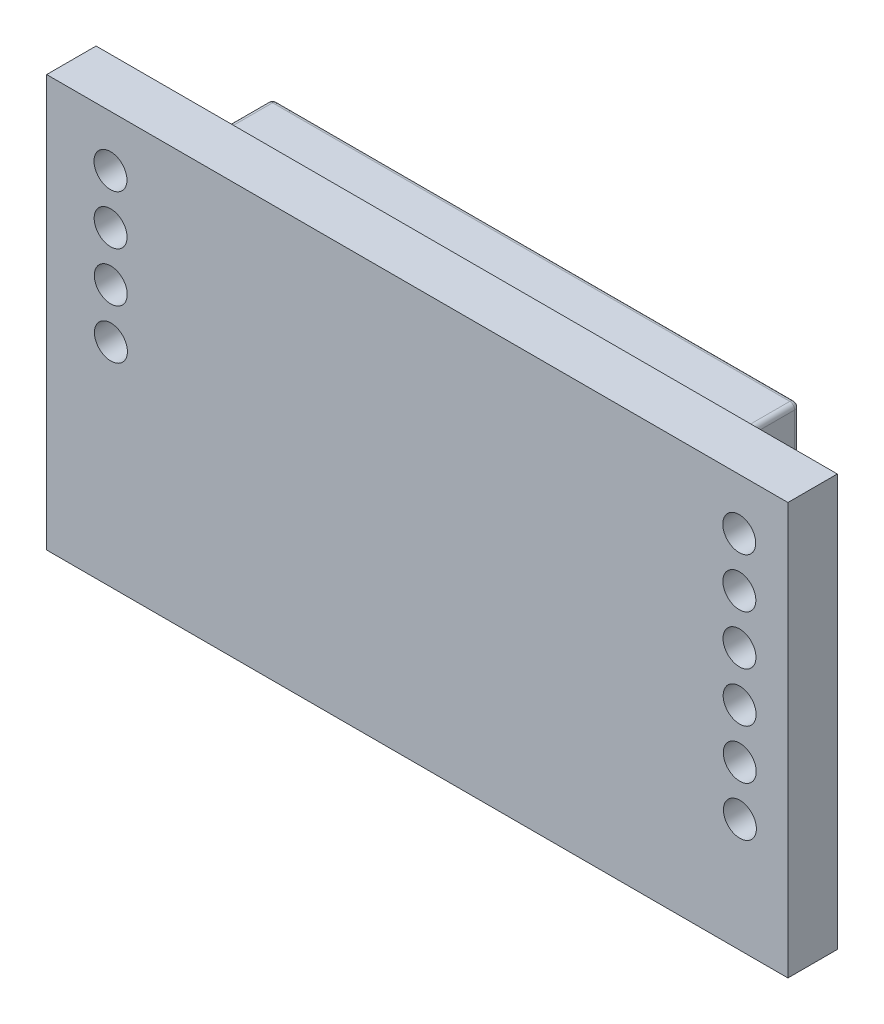
ISO-10303-21;
HEADER;
FILE_DESCRIPTION(('STEP AP214'),'2;1');
FILE_NAME('part.step','',(''),(''),'','','');
FILE_SCHEMA(('AUTOMOTIVE_DESIGN { 1 0 10303 214 1 1 1 1 }'));
ENDSEC;
DATA;
#1=APPLICATION_CONTEXT('core data for automotive mechanical design processes');
#2=APPLICATION_PROTOCOL_DEFINITION('international standard','automotive_design',2000,#1);
#3=PRODUCT_CONTEXT('',#1,'mechanical');
#4=PRODUCT('Part','Part','',(#3));
#5=PRODUCT_RELATED_PRODUCT_CATEGORY('part','',(#4));
#6=PRODUCT_DEFINITION_FORMATION('','',#4);
#7=PRODUCT_DEFINITION_CONTEXT('part definition',#1,'design');
#8=PRODUCT_DEFINITION('design','',#6,#7);
#9=PRODUCT_DEFINITION_SHAPE('','',#8);
#10=(LENGTH_UNIT() NAMED_UNIT(*) SI_UNIT(.MILLI.,.METRE.));
#11=(NAMED_UNIT(*) PLANE_ANGLE_UNIT() SI_UNIT($,.RADIAN.));
#12=(NAMED_UNIT(*) SI_UNIT($,.STERADIAN.) SOLID_ANGLE_UNIT());
#13=UNCERTAINTY_MEASURE_WITH_UNIT(LENGTH_MEASURE(1.E-05),#10,'distance_accuracy_value','');
#14=(GEOMETRIC_REPRESENTATION_CONTEXT(3) GLOBAL_UNCERTAINTY_ASSIGNED_CONTEXT((#13)) GLOBAL_UNIT_ASSIGNED_CONTEXT((#10,
#11,#12)) REPRESENTATION_CONTEXT('',''));
#15=CARTESIAN_POINT('',(0.,0.,0.));
#16=DIRECTION('',(0.,0.,1.));
#17=DIRECTION('',(1.,0.,0.));
#18=AXIS2_PLACEMENT_3D('',#15,#16,#17);
#19=CARTESIAN_POINT('',(0.,0.,0.));
#20=DIRECTION('',(0.,0.,1.));
#21=DIRECTION('',(1.,0.,0.));
#22=AXIS2_PLACEMENT_3D('',#19,#20,#21);
#23=PLANE('',#22);
#24=CARTESIAN_POINT('',(-41.1176214928793,18.8864329072938,0.));
#25=DIRECTION('',(0.,0.,1.));
#26=DIRECTION('',(1.,0.,0.));
#27=AXIS2_PLACEMENT_3D('',#24,#25,#26);
#28=CIRCLE('',#27,0.999999999999998);
#29=CARTESIAN_POINT('',(-40.1176214928793,18.8864329072938,0.));
#30=VERTEX_POINT('',#29);
#31=EDGE_CURVE('E243',#30,#30,#28,.F.);
#32=ORIENTED_EDGE('',*,*,#31,.F.);
#33=EDGE_LOOP('',(#32));
#34=FACE_BOUND('',#33,.T.);
#35=CARTESIAN_POINT('',(-41.1089333233604,15.8864454880352,0.));
#36=DIRECTION('',(0.,0.,1.));
#37=DIRECTION('',(1.,0.,0.));
#38=AXIS2_PLACEMENT_3D('',#35,#36,#37);
#39=CIRCLE('',#38,0.999999999999998);
#40=CARTESIAN_POINT('',(-40.1089333233604,15.8864454880352,0.));
#41=VERTEX_POINT('',#40);
#42=EDGE_CURVE('E284',#41,#41,#39,.F.);
#43=ORIENTED_EDGE('',*,*,#42,.F.);
#44=EDGE_LOOP('',(#43));
#45=FACE_BOUND('',#44,.T.);
#46=CARTESIAN_POINT('',(-41.1002451538415,12.8864580687765,0.));
#47=DIRECTION('',(0.,0.,1.));
#48=DIRECTION('',(1.,0.,0.));
#49=AXIS2_PLACEMENT_3D('',#46,#47,#48);
#50=CIRCLE('',#49,0.999999999999998);
#51=CARTESIAN_POINT('',(-40.1002451538415,12.8864580687765,0.));
#52=VERTEX_POINT('',#51);
#53=EDGE_CURVE('E281',#52,#52,#50,.F.);
#54=ORIENTED_EDGE('',*,*,#53,.F.);
#55=EDGE_LOOP('',(#54));
#56=FACE_BOUND('',#55,.T.);
#57=CARTESIAN_POINT('',(-2.91528625012535,6.88647394013173,0.));
#58=DIRECTION('',(0.,0.,1.));
#59=DIRECTION('',(1.,0.,0.));
#60=AXIS2_PLACEMENT_3D('',#57,#58,#59);
#61=CIRCLE('',#60,1.);
#62=CARTESIAN_POINT('',(-1.91528625012535,6.88647394013173,0.));
#63=VERTEX_POINT('',#62);
#64=EDGE_CURVE('E278',#63,#63,#61,.F.);
#65=ORIENTED_EDGE('',*,*,#64,.F.);
#66=EDGE_LOOP('',(#65));
#67=FACE_BOUND('',#66,.T.);
#68=CARTESIAN_POINT('',(-2.92330723385967,9.88646321741589,0.));
#69=DIRECTION('',(0.,0.,1.));
#70=DIRECTION('',(1.,0.,0.));
#71=AXIS2_PLACEMENT_3D('',#68,#69,#70);
#72=CIRCLE('',#71,1.);
#73=CARTESIAN_POINT('',(-1.92330723385967,9.88646321741589,0.));
#74=VERTEX_POINT('',#73);
#75=EDGE_CURVE('E274',#74,#74,#72,.F.);
#76=ORIENTED_EDGE('',*,*,#75,.F.);
#77=EDGE_LOOP('',(#76));
#78=FACE_BOUND('',#77,.T.);
#79=CARTESIAN_POINT('',(-2.93132821759399,12.8864524947,0.));
#80=DIRECTION('',(0.,0.,1.));
#81=DIRECTION('',(1.,0.,0.));
#82=AXIS2_PLACEMENT_3D('',#79,#80,#81);
#83=CIRCLE('',#82,1.);
#84=CARTESIAN_POINT('',(-1.93132821759399,12.8864524947,0.));
#85=VERTEX_POINT('',#84);
#86=EDGE_CURVE('E270',#85,#85,#83,.F.);
#87=ORIENTED_EDGE('',*,*,#86,.F.);
#88=EDGE_LOOP('',(#87));
#89=FACE_BOUND('',#88,.T.);
#90=CARTESIAN_POINT('',(-2.95539116879695,21.8864203265525,0.));
#91=DIRECTION('',(0.,0.,1.));
#92=DIRECTION('',(1.,0.,0.));
#93=AXIS2_PLACEMENT_3D('',#90,#91,#92);
#94=CIRCLE('',#93,1.);
#95=CARTESIAN_POINT('',(-1.95539116879695,21.8864203265525,0.));
#96=VERTEX_POINT('',#95);
#97=EDGE_CURVE('E266',#96,#96,#94,.F.);
#98=ORIENTED_EDGE('',*,*,#97,.F.);
#99=EDGE_LOOP('',(#98));
#100=FACE_BOUND('',#99,.T.);
#101=CARTESIAN_POINT('',(-2.93934920132831,15.8864417719842,0.));
#102=DIRECTION('',(0.,0.,1.));
#103=DIRECTION('',(1.,0.,0.));
#104=AXIS2_PLACEMENT_3D('',#101,#102,#103);
#105=CIRCLE('',#104,1.);
#106=CARTESIAN_POINT('',(-1.93934920132831,15.8864417719842,0.));
#107=VERTEX_POINT('',#106);
#108=EDGE_CURVE('E262',#107,#107,#105,.F.);
#109=ORIENTED_EDGE('',*,*,#108,.F.);
#110=EDGE_LOOP('',(#109));
#111=FACE_BOUND('',#110,.T.);
#112=CARTESIAN_POINT('',(-41.1263096623981,21.8864203265525,0.));
#113=DIRECTION('',(0.,0.,1.));
#114=DIRECTION('',(1.,0.,0.));
#115=AXIS2_PLACEMENT_3D('',#112,#113,#114);
#116=CIRCLE('',#115,0.999999999999998);
#117=CARTESIAN_POINT('',(-40.1263096623981,21.8864203265525,0.));
#118=VERTEX_POINT('',#117);
#119=EDGE_CURVE('E258',#118,#118,#116,.F.);
#120=ORIENTED_EDGE('',*,*,#119,.F.);
#121=EDGE_LOOP('',(#120));
#122=FACE_BOUND('',#121,.T.);
#123=CARTESIAN_POINT('',(-2.94737018506263,18.8864310492684,0.));
#124=DIRECTION('',(0.,0.,1.));
#125=DIRECTION('',(1.,0.,0.));
#126=AXIS2_PLACEMENT_3D('',#123,#124,#125);
#127=CIRCLE('',#126,1.);
#128=CARTESIAN_POINT('',(-1.94737018506263,18.8864310492684,0.));
#129=VERTEX_POINT('',#128);
#130=EDGE_CURVE('E254',#129,#129,#127,.F.);
#131=ORIENTED_EDGE('',*,*,#130,.F.);
#132=EDGE_LOOP('',(#131));
#133=FACE_BOUND('',#132,.T.);
#134=DIRECTION('',(0.,1.,0.));
#135=VECTOR('',#134,1.);
#136=CARTESIAN_POINT('',(0.,0.,0.));
#137=LINE('',#136,#135);
#138=CARTESIAN_POINT('',(0.,0.,0.));
#139=VERTEX_POINT('',#138);
#140=CARTESIAN_POINT('',(0.,25.,0.));
#141=VERTEX_POINT('',#140);
#142=EDGE_CURVE('E169',#139,#141,#137,.T.);
#143=ORIENTED_EDGE('',*,*,#142,.F.);
#144=DIRECTION('',(1.,0.,0.));
#145=VECTOR('',#144,1.);
#146=CARTESIAN_POINT('',(0.,0.,0.));
#147=LINE('',#146,#145);
#148=CARTESIAN_POINT('',(-45.,0.,0.));
#149=VERTEX_POINT('',#148);
#150=EDGE_CURVE('E165',#149,#139,#147,.T.);
#151=ORIENTED_EDGE('',*,*,#150,.F.);
#152=DIRECTION('',(0.,-1.,0.));
#153=VECTOR('',#152,1.);
#154=CARTESIAN_POINT('',(-45.,0.,0.));
#155=LINE('',#154,#153);
#156=CARTESIAN_POINT('',(-45.,25.,0.));
#157=VERTEX_POINT('',#156);
#158=EDGE_CURVE('E312',#157,#149,#155,.T.);
#159=ORIENTED_EDGE('',*,*,#158,.F.);
#160=DIRECTION('',(-1.,0.,0.));
#161=VECTOR('',#160,1.);
#162=CARTESIAN_POINT('',(0.,25.,0.));
#163=LINE('',#162,#161);
#164=EDGE_CURVE('E310',#141,#157,#163,.T.);
#165=ORIENTED_EDGE('',*,*,#164,.F.);
#166=EDGE_LOOP('',(#143,#151,#159,#165));
#167=FACE_BOUND('',#166,.T.);
#168=DIRECTION('',(-1.,0.,0.));
#169=VECTOR('',#168,1.);
#170=CARTESIAN_POINT('',(-5.78808793069561,2.17086464176104,0.));
#171=LINE('',#170,#169);
#172=CARTESIAN_POINT('',(-6.08808793069561,2.17086464176104,0.));
#173=VERTEX_POINT('',#172);
#174=CARTESIAN_POINT('',(-37.4880879306956,2.17086464176104,0.));
#175=VERTEX_POINT('',#174);
#176=EDGE_CURVE('E203',#173,#175,#171,.T.);
#177=ORIENTED_EDGE('',*,*,#176,.F.);
#178=CARTESIAN_POINT('',(-6.08808793069561,2.47086464176104,0.));
#179=DIRECTION('',(0.,0.,1.));
#180=DIRECTION('',(1.,0.,0.));
#181=AXIS2_PLACEMENT_3D('',#178,#179,#180);
#182=CIRCLE('',#181,0.3);
#183=CARTESIAN_POINT('',(-5.78808793069561,2.47086464176104,0.));
#184=VERTEX_POINT('',#183);
#185=EDGE_CURVE('E180',#173,#184,#182,.T.);
#186=ORIENTED_EDGE('',*,*,#185,.T.);
#187=DIRECTION('',(0.,-1.,0.));
#188=VECTOR('',#187,1.);
#189=CARTESIAN_POINT('',(-5.78808793069561,24.170864641761,0.));
#190=LINE('',#189,#188);
#191=CARTESIAN_POINT('',(-5.78808793069561,23.870864641761,0.));
#192=VERTEX_POINT('',#191);
#193=EDGE_CURVE('E304',#192,#184,#190,.T.);
#194=ORIENTED_EDGE('',*,*,#193,.F.);
#195=CARTESIAN_POINT('',(-6.08808793069561,23.870864641761,0.));
#196=DIRECTION('',(0.,0.,1.));
#197=DIRECTION('',(1.,0.,0.));
#198=AXIS2_PLACEMENT_3D('',#195,#196,#197);
#199=CIRCLE('',#198,0.3);
#200=CARTESIAN_POINT('',(-6.08808793069561,24.170864641761,0.));
#201=VERTEX_POINT('',#200);
#202=EDGE_CURVE('E50',#192,#201,#199,.T.);
#203=ORIENTED_EDGE('',*,*,#202,.T.);
#204=DIRECTION('',(-1.,0.,0.));
#205=VECTOR('',#204,1.);
#206=CARTESIAN_POINT('',(-5.78808793069561,24.170864641761,0.));
#207=LINE('',#206,#205);
#208=CARTESIAN_POINT('',(-37.4880879306956,24.170864641761,0.));
#209=VERTEX_POINT('',#208);
#210=EDGE_CURVE('E302',#201,#209,#207,.T.);
#211=ORIENTED_EDGE('',*,*,#210,.T.);
#212=CARTESIAN_POINT('',(-37.4880879306956,23.870864641761,0.));
#213=DIRECTION('',(0.,0.,1.));
#214=DIRECTION('',(1.,0.,0.));
#215=AXIS2_PLACEMENT_3D('',#212,#213,#214);
#216=CIRCLE('',#215,0.3);
#217=CARTESIAN_POINT('',(-37.7880879306956,23.870864641761,0.));
#218=VERTEX_POINT('',#217);
#219=EDGE_CURVE('E12',#209,#218,#216,.T.);
#220=ORIENTED_EDGE('',*,*,#219,.T.);
#221=DIRECTION('',(0.,-1.,0.));
#222=VECTOR('',#221,1.);
#223=CARTESIAN_POINT('',(-37.7880879306956,24.170864641761,0.));
#224=LINE('',#223,#222);
#225=CARTESIAN_POINT('',(-37.7880879306956,2.47086464176104,0.));
#226=VERTEX_POINT('',#225);
#227=EDGE_CURVE('E300',#218,#226,#224,.T.);
#228=ORIENTED_EDGE('',*,*,#227,.T.);
#229=CARTESIAN_POINT('',(-37.4880879306956,2.47086464176104,0.));
#230=DIRECTION('',(0.,0.,1.));
#231=DIRECTION('',(1.,0.,0.));
#232=AXIS2_PLACEMENT_3D('',#229,#230,#231);
#233=CIRCLE('',#232,0.3);
#234=EDGE_CURVE('E214',#226,#175,#233,.T.);
#235=ORIENTED_EDGE('',*,*,#234,.T.);
#236=EDGE_LOOP('',(#177,#186,#194,#203,#211,#220,#228,#235));
#237=FACE_BOUND('',#236,.T.);
#238=ADVANCED_FACE('F41',(#34,#45,#56,#67,#78,#89,#100,#111,#122,#133,#167,#237),#23,.F.);
#239=CARTESIAN_POINT('',(0.,0.,3.));
#240=DIRECTION('',(-1.,0.,0.));
#241=DIRECTION('',(0.,0.,1.));
#242=AXIS2_PLACEMENT_3D('',#239,#240,#241);
#243=PLANE('',#242);
#244=ORIENTED_EDGE('',*,*,#142,.T.);
#245=DIRECTION('',(0.,0.,-1.));
#246=VECTOR('',#245,1.);
#247=CARTESIAN_POINT('',(0.,25.,3.));
#248=LINE('',#247,#246);
#249=CARTESIAN_POINT('',(0.,25.,3.));
#250=VERTEX_POINT('',#249);
#251=EDGE_CURVE('E149',#250,#141,#248,.T.);
#252=ORIENTED_EDGE('',*,*,#251,.F.);
#253=DIRECTION('',(0.,1.,0.));
#254=VECTOR('',#253,1.);
#255=CARTESIAN_POINT('',(0.,0.,3.));
#256=LINE('',#255,#254);
#257=CARTESIAN_POINT('',(0.,0.,3.));
#258=VERTEX_POINT('',#257);
#259=EDGE_CURVE('E156',#258,#250,#256,.T.);
#260=ORIENTED_EDGE('',*,*,#259,.F.);
#261=DIRECTION('',(0.,0.,-1.));
#262=VECTOR('',#261,1.);
#263=CARTESIAN_POINT('',(0.,0.,3.));
#264=LINE('',#263,#262);
#265=EDGE_CURVE('E308',#258,#139,#264,.T.);
#266=ORIENTED_EDGE('',*,*,#265,.T.);
#267=EDGE_LOOP('',(#244,#252,#260,#266));
#268=FACE_BOUND('',#267,.T.);
#269=ADVANCED_FACE('F167',(#268),#243,.F.);
#270=CARTESIAN_POINT('',(0.,25.,3.));
#271=DIRECTION('',(0.,-1.,0.));
#272=DIRECTION('',(1.,0.,0.));
#273=AXIS2_PLACEMENT_3D('',#270,#271,#272);
#274=PLANE('',#273);
#275=ORIENTED_EDGE('',*,*,#164,.T.);
#276=DIRECTION('',(0.,0.,-1.));
#277=VECTOR('',#276,1.);
#278=CARTESIAN_POINT('',(-45.,25.,3.));
#279=LINE('',#278,#277);
#280=CARTESIAN_POINT('',(-45.,25.,3.));
#281=VERTEX_POINT('',#280);
#282=EDGE_CURVE('E152',#281,#157,#279,.T.);
#283=ORIENTED_EDGE('',*,*,#282,.F.);
#284=DIRECTION('',(-1.,0.,0.));
#285=VECTOR('',#284,1.);
#286=CARTESIAN_POINT('',(0.,25.,3.));
#287=LINE('',#286,#285);
#288=EDGE_CURVE('E145',#250,#281,#287,.T.);
#289=ORIENTED_EDGE('',*,*,#288,.F.);
#290=ORIENTED_EDGE('',*,*,#251,.T.);
#291=EDGE_LOOP('',(#275,#283,#289,#290));
#292=FACE_BOUND('',#291,.T.);
#293=ADVANCED_FACE('F147',(#292),#274,.F.);
#294=CARTESIAN_POINT('',(-45.,0.,3.));
#295=DIRECTION('',(1.,0.,0.));
#296=DIRECTION('',(0.,0.,-1.));
#297=AXIS2_PLACEMENT_3D('',#294,#295,#296);
#298=PLANE('',#297);
#299=ORIENTED_EDGE('',*,*,#158,.T.);
#300=DIRECTION('',(0.,0.,-1.));
#301=VECTOR('',#300,1.);
#302=CARTESIAN_POINT('',(-45.,0.,3.));
#303=LINE('',#302,#301);
#304=CARTESIAN_POINT('',(-45.,0.,3.));
#305=VERTEX_POINT('',#304);
#306=EDGE_CURVE('E174',#305,#149,#303,.T.);
#307=ORIENTED_EDGE('',*,*,#306,.F.);
#308=DIRECTION('',(0.,-1.,0.));
#309=VECTOR('',#308,1.);
#310=CARTESIAN_POINT('',(-45.,0.,3.));
#311=LINE('',#310,#309);
#312=EDGE_CURVE('E155',#281,#305,#311,.T.);
#313=ORIENTED_EDGE('',*,*,#312,.F.);
#314=ORIENTED_EDGE('',*,*,#282,.T.);
#315=EDGE_LOOP('',(#299,#307,#313,#314));
#316=FACE_BOUND('',#315,.T.);
#317=ADVANCED_FACE('F323',(#316),#298,.F.);
#318=CARTESIAN_POINT('',(0.,0.,3.));
#319=DIRECTION('',(0.,1.,0.));
#320=DIRECTION('',(-1.,0.,0.));
#321=AXIS2_PLACEMENT_3D('',#318,#319,#320);
#322=PLANE('',#321);
#323=ORIENTED_EDGE('',*,*,#150,.T.);
#324=ORIENTED_EDGE('',*,*,#265,.F.);
#325=DIRECTION('',(1.,0.,0.));
#326=VECTOR('',#325,1.);
#327=CARTESIAN_POINT('',(0.,0.,3.));
#328=LINE('',#327,#326);
#329=EDGE_CURVE('E161',#305,#258,#328,.T.);
#330=ORIENTED_EDGE('',*,*,#329,.F.);
#331=ORIENTED_EDGE('',*,*,#306,.T.);
#332=EDGE_LOOP('',(#323,#324,#330,#331));
#333=FACE_BOUND('',#332,.T.);
#334=ADVANCED_FACE('F319',(#333),#322,.F.);
#335=CARTESIAN_POINT('',(0.,0.,3.));
#336=DIRECTION('',(0.,0.,1.));
#337=DIRECTION('',(1.,0.,0.));
#338=AXIS2_PLACEMENT_3D('',#335,#336,#337);
#339=PLANE('',#338);
#340=CARTESIAN_POINT('',(-41.1176214928793,18.8864329072938,3.));
#341=DIRECTION('',(0.,0.,1.));
#342=DIRECTION('',(1.,0.,0.));
#343=AXIS2_PLACEMENT_3D('',#340,#341,#342);
#344=CIRCLE('',#343,0.999999999999998);
#345=CARTESIAN_POINT('',(-40.1176214928793,18.8864329072938,3.));
#346=VERTEX_POINT('',#345);
#347=EDGE_CURVE('E45',#346,#346,#344,.F.);
#348=ORIENTED_EDGE('',*,*,#347,.T.);
#349=EDGE_LOOP('',(#348));
#350=FACE_BOUND('',#349,.T.);
#351=CARTESIAN_POINT('',(-41.1089333233604,15.8864454880352,3.));
#352=DIRECTION('',(0.,0.,1.));
#353=DIRECTION('',(1.,0.,0.));
#354=AXIS2_PLACEMENT_3D('',#351,#352,#353);
#355=CIRCLE('',#354,0.999999999999998);
#356=CARTESIAN_POINT('',(-40.1089333233604,15.8864454880352,3.));
#357=VERTEX_POINT('',#356);
#358=EDGE_CURVE('E282',#357,#357,#355,.F.);
#359=ORIENTED_EDGE('',*,*,#358,.T.);
#360=EDGE_LOOP('',(#359));
#361=FACE_BOUND('',#360,.T.);
#362=CARTESIAN_POINT('',(-41.1002451538415,12.8864580687765,3.));
#363=DIRECTION('',(0.,0.,1.));
#364=DIRECTION('',(1.,0.,0.));
#365=AXIS2_PLACEMENT_3D('',#362,#363,#364);
#366=CIRCLE('',#365,0.999999999999998);
#367=CARTESIAN_POINT('',(-40.1002451538415,12.8864580687765,3.));
#368=VERTEX_POINT('',#367);
#369=EDGE_CURVE('E279',#368,#368,#366,.F.);
#370=ORIENTED_EDGE('',*,*,#369,.T.);
#371=EDGE_LOOP('',(#370));
#372=FACE_BOUND('',#371,.T.);
#373=CARTESIAN_POINT('',(-2.91528625012535,6.88647394013173,3.));
#374=DIRECTION('',(0.,0.,1.));
#375=DIRECTION('',(1.,0.,0.));
#376=AXIS2_PLACEMENT_3D('',#373,#374,#375);
#377=CIRCLE('',#376,1.);
#378=CARTESIAN_POINT('',(-1.91528625012535,6.88647394013173,3.));
#379=VERTEX_POINT('',#378);
#380=EDGE_CURVE('E275',#379,#379,#377,.F.);
#381=ORIENTED_EDGE('',*,*,#380,.T.);
#382=EDGE_LOOP('',(#381));
#383=FACE_BOUND('',#382,.T.);
#384=CARTESIAN_POINT('',(-2.92330723385967,9.88646321741589,3.));
#385=DIRECTION('',(0.,0.,1.));
#386=DIRECTION('',(1.,0.,0.));
#387=AXIS2_PLACEMENT_3D('',#384,#385,#386);
#388=CIRCLE('',#387,1.);
#389=CARTESIAN_POINT('',(-1.92330723385967,9.88646321741589,3.));
#390=VERTEX_POINT('',#389);
#391=EDGE_CURVE('E271',#390,#390,#388,.F.);
#392=ORIENTED_EDGE('',*,*,#391,.T.);
#393=EDGE_LOOP('',(#392));
#394=FACE_BOUND('',#393,.T.);
#395=CARTESIAN_POINT('',(-2.93132821759399,12.8864524947,3.));
#396=DIRECTION('',(0.,0.,1.));
#397=DIRECTION('',(1.,0.,0.));
#398=AXIS2_PLACEMENT_3D('',#395,#396,#397);
#399=CIRCLE('',#398,1.);
#400=CARTESIAN_POINT('',(-1.93132821759399,12.8864524947,3.));
#401=VERTEX_POINT('',#400);
#402=EDGE_CURVE('E267',#401,#401,#399,.F.);
#403=ORIENTED_EDGE('',*,*,#402,.T.);
#404=EDGE_LOOP('',(#403));
#405=FACE_BOUND('',#404,.T.);
#406=CARTESIAN_POINT('',(-2.95539116879695,21.8864203265525,3.));
#407=DIRECTION('',(0.,0.,1.));
#408=DIRECTION('',(1.,0.,0.));
#409=AXIS2_PLACEMENT_3D('',#406,#407,#408);
#410=CIRCLE('',#409,1.);
#411=CARTESIAN_POINT('',(-1.95539116879695,21.8864203265525,3.));
#412=VERTEX_POINT('',#411);
#413=EDGE_CURVE('E263',#412,#412,#410,.F.);
#414=ORIENTED_EDGE('',*,*,#413,.T.);
#415=EDGE_LOOP('',(#414));
#416=FACE_BOUND('',#415,.T.);
#417=CARTESIAN_POINT('',(-2.93934920132831,15.8864417719842,3.));
#418=DIRECTION('',(0.,0.,1.));
#419=DIRECTION('',(1.,0.,0.));
#420=AXIS2_PLACEMENT_3D('',#417,#418,#419);
#421=CIRCLE('',#420,1.);
#422=CARTESIAN_POINT('',(-1.93934920132831,15.8864417719842,3.));
#423=VERTEX_POINT('',#422);
#424=EDGE_CURVE('E259',#423,#423,#421,.F.);
#425=ORIENTED_EDGE('',*,*,#424,.T.);
#426=EDGE_LOOP('',(#425));
#427=FACE_BOUND('',#426,.T.);
#428=CARTESIAN_POINT('',(-41.1263096623981,21.8864203265525,3.));
#429=DIRECTION('',(0.,0.,1.));
#430=DIRECTION('',(1.,0.,0.));
#431=AXIS2_PLACEMENT_3D('',#428,#429,#430);
#432=CIRCLE('',#431,0.999999999999998);
#433=CARTESIAN_POINT('',(-40.1263096623981,21.8864203265525,3.));
#434=VERTEX_POINT('',#433);
#435=EDGE_CURVE('E255',#434,#434,#432,.F.);
#436=ORIENTED_EDGE('',*,*,#435,.T.);
#437=EDGE_LOOP('',(#436));
#438=FACE_BOUND('',#437,.T.);
#439=CARTESIAN_POINT('',(-2.94737018506263,18.8864310492684,3.));
#440=DIRECTION('',(0.,0.,1.));
#441=DIRECTION('',(1.,0.,0.));
#442=AXIS2_PLACEMENT_3D('',#439,#440,#441);
#443=CIRCLE('',#442,1.);
#444=CARTESIAN_POINT('',(-1.94737018506263,18.8864310492684,3.));
#445=VERTEX_POINT('',#444);
#446=EDGE_CURVE('E251',#445,#445,#443,.F.);
#447=ORIENTED_EDGE('',*,*,#446,.T.);
#448=EDGE_LOOP('',(#447));
#449=FACE_BOUND('',#448,.T.);
#450=ORIENTED_EDGE('',*,*,#259,.T.);
#451=ORIENTED_EDGE('',*,*,#288,.T.);
#452=ORIENTED_EDGE('',*,*,#312,.T.);
#453=ORIENTED_EDGE('',*,*,#329,.T.);
#454=EDGE_LOOP('',(#450,#451,#452,#453));
#455=FACE_BOUND('',#454,.T.);
#456=ADVANCED_FACE('F159',(#350,#361,#372,#383,#394,#405,#416,#427,#438,#449,#455),#339,.T.);
#457=CARTESIAN_POINT('',(-5.78808793069561,2.17086464176104,-3.5));
#458=DIRECTION('',(0.,1.,0.));
#459=DIRECTION('',(0.,0.,1.));
#460=AXIS2_PLACEMENT_3D('',#457,#458,#459);
#461=PLANE('',#460);
#462=ORIENTED_EDGE('',*,*,#176,.T.);
#463=DIRECTION('',(0.,0.,1.));
#464=VECTOR('',#463,1.);
#465=CARTESIAN_POINT('',(-37.4880879306956,2.17086464176104,-3.2));
#466=LINE('',#465,#464);
#467=CARTESIAN_POINT('',(-37.4880879306956,2.17086464176104,-3.2));
#468=VERTEX_POINT('',#467);
#469=EDGE_CURVE('E208',#175,#468,#466,.F.);
#470=ORIENTED_EDGE('',*,*,#469,.T.);
#471=DIRECTION('',(-1.,0.,0.));
#472=VECTOR('',#471,1.);
#473=CARTESIAN_POINT('',(-5.78808793069561,2.17086464176104,-3.2));
#474=LINE('',#473,#472);
#475=CARTESIAN_POINT('',(-6.08808793069561,2.17086464176104,-3.2));
#476=VERTEX_POINT('',#475);
#477=EDGE_CURVE('E193',#468,#476,#474,.F.);
#478=ORIENTED_EDGE('',*,*,#477,.T.);
#479=DIRECTION('',(0.,0.,1.));
#480=VECTOR('',#479,1.);
#481=CARTESIAN_POINT('',(-6.08808793069561,2.17086464176104,-3.5));
#482=LINE('',#481,#480);
#483=EDGE_CURVE('E170',#476,#173,#482,.T.);
#484=ORIENTED_EDGE('',*,*,#483,.T.);
#485=EDGE_LOOP('',(#462,#470,#478,#484));
#486=FACE_BOUND('',#485,.T.);
#487=ADVANCED_FACE('F344',(#486),#461,.F.);
#488=CARTESIAN_POINT('',(-37.7880879306956,24.170864641761,-3.5));
#489=DIRECTION('',(-1.,0.,0.));
#490=DIRECTION('',(0.,0.,1.));
#491=AXIS2_PLACEMENT_3D('',#488,#489,#490);
#492=PLANE('',#491);
#493=ORIENTED_EDGE('',*,*,#227,.F.);
#494=DIRECTION('',(0.,0.,1.));
#495=VECTOR('',#494,1.);
#496=CARTESIAN_POINT('',(-37.7880879306956,23.870864641761,-3.5));
#497=LINE('',#496,#495);
#498=CARTESIAN_POINT('',(-37.7880879306956,23.870864641761,-3.2));
#499=VERTEX_POINT('',#498);
#500=EDGE_CURVE('E233',#218,#499,#497,.F.);
#501=ORIENTED_EDGE('',*,*,#500,.T.);
#502=DIRECTION('',(0.,-1.,0.));
#503=VECTOR('',#502,1.);
#504=CARTESIAN_POINT('',(-37.7880879306956,2.47086464176104,-3.2));
#505=LINE('',#504,#503);
#506=CARTESIAN_POINT('',(-37.7880879306956,2.47086464176104,-3.2));
#507=VERTEX_POINT('',#506);
#508=EDGE_CURVE('E195',#499,#507,#505,.T.);
#509=ORIENTED_EDGE('',*,*,#508,.T.);
#510=DIRECTION('',(0.,0.,1.));
#511=VECTOR('',#510,1.);
#512=CARTESIAN_POINT('',(-37.7880879306956,2.47086464176104,0.));
#513=LINE('',#512,#511);
#514=EDGE_CURVE('E205',#507,#226,#513,.T.);
#515=ORIENTED_EDGE('',*,*,#514,.T.);
#516=EDGE_LOOP('',(#493,#501,#509,#515));
#517=FACE_BOUND('',#516,.T.);
#518=ADVANCED_FACE('F348',(#517),#492,.T.);
#519=CARTESIAN_POINT('',(-5.78808793069561,24.170864641761,-3.5));
#520=DIRECTION('',(0.,1.,0.));
#521=DIRECTION('',(-1.,0.,0.));
#522=AXIS2_PLACEMENT_3D('',#519,#520,#521);
#523=PLANE('',#522);
#524=ORIENTED_EDGE('',*,*,#210,.F.);
#525=DIRECTION('',(0.,0.,1.));
#526=VECTOR('',#525,1.);
#527=CARTESIAN_POINT('',(-6.08808793069561,24.170864641761,-3.2));
#528=LINE('',#527,#526);
#529=CARTESIAN_POINT('',(-6.08808793069561,24.170864641761,-3.2));
#530=VERTEX_POINT('',#529);
#531=EDGE_CURVE('E229',#201,#530,#528,.F.);
#532=ORIENTED_EDGE('',*,*,#531,.T.);
#533=DIRECTION('',(-1.,0.,0.));
#534=VECTOR('',#533,1.);
#535=CARTESIAN_POINT('',(-37.4880879306956,24.170864641761,-3.2));
#536=LINE('',#535,#534);
#537=CARTESIAN_POINT('',(-37.4880879306956,24.170864641761,-3.2));
#538=VERTEX_POINT('',#537);
#539=EDGE_CURVE('E225',#530,#538,#536,.T.);
#540=ORIENTED_EDGE('',*,*,#539,.T.);
#541=DIRECTION('',(0.,0.,1.));
#542=VECTOR('',#541,1.);
#543=CARTESIAN_POINT('',(-37.4880879306956,24.170864641761,-3.5));
#544=LINE('',#543,#542);
#545=EDGE_CURVE('E227',#538,#209,#544,.T.);
#546=ORIENTED_EDGE('',*,*,#545,.T.);
#547=EDGE_LOOP('',(#524,#532,#540,#546));
#548=FACE_BOUND('',#547,.T.);
#549=ADVANCED_FACE('F352',(#548),#523,.T.);
#550=CARTESIAN_POINT('',(-5.78808793069561,24.170864641761,-3.5));
#551=DIRECTION('',(-1.,0.,0.));
#552=DIRECTION('',(0.,-1.,0.));
#553=AXIS2_PLACEMENT_3D('',#550,#551,#552);
#554=PLANE('',#553);
#555=DIRECTION('',(0.,-1.,0.));
#556=VECTOR('',#555,1.);
#557=CARTESIAN_POINT('',(-5.78808793069561,24.170864641761,-3.2));
#558=LINE('',#557,#556);
#559=CARTESIAN_POINT('',(-5.78808793069561,2.47086464176104,-3.2));
#560=VERTEX_POINT('',#559);
#561=CARTESIAN_POINT('',(-5.78808793069561,23.870864641761,-3.2));
#562=VERTEX_POINT('',#561);
#563=EDGE_CURVE('E188',#560,#562,#558,.F.);
#564=ORIENTED_EDGE('',*,*,#563,.T.);
#565=DIRECTION('',(0.,0.,1.));
#566=VECTOR('',#565,1.);
#567=CARTESIAN_POINT('',(-5.78808793069561,23.870864641761,0.));
#568=LINE('',#567,#566);
#569=EDGE_CURVE('E216',#562,#192,#568,.T.);
#570=ORIENTED_EDGE('',*,*,#569,.T.);
#571=ORIENTED_EDGE('',*,*,#193,.T.);
#572=DIRECTION('',(0.,0.,1.));
#573=VECTOR('',#572,1.);
#574=CARTESIAN_POINT('',(-5.78808793069561,2.47086464176104,-3.5));
#575=LINE('',#574,#573);
#576=EDGE_CURVE('E172',#184,#560,#575,.F.);
#577=ORIENTED_EDGE('',*,*,#576,.T.);
#578=EDGE_LOOP('',(#564,#570,#571,#577));
#579=FACE_BOUND('',#578,.T.);
#580=ADVANCED_FACE('F356',(#579),#554,.F.);
#581=CARTESIAN_POINT('',(0.,0.,-3.5));
#582=DIRECTION('',(0.,0.,1.));
#583=DIRECTION('',(1.,0.,0.));
#584=AXIS2_PLACEMENT_3D('',#581,#582,#583);
#585=PLANE('',#584);
#586=DIRECTION('',(0.,-1.,0.));
#587=VECTOR('',#586,1.);
#588=CARTESIAN_POINT('',(-37.4880879306956,24.170864641761,-3.5));
#589=LINE('',#588,#587);
#590=CARTESIAN_POINT('',(-37.4880879306956,2.47086464176104,-3.5));
#591=VERTEX_POINT('',#590);
#592=CARTESIAN_POINT('',(-37.4880879306956,23.870864641761,-3.5));
#593=VERTEX_POINT('',#592);
#594=EDGE_CURVE('E212',#591,#593,#589,.F.);
#595=ORIENTED_EDGE('',*,*,#594,.T.);
#596=DIRECTION('',(-1.,0.,0.));
#597=VECTOR('',#596,1.);
#598=CARTESIAN_POINT('',(-6.08808793069561,23.870864641761,-3.5));
#599=LINE('',#598,#597);
#600=CARTESIAN_POINT('',(-6.08808793069561,23.870864641761,-3.5));
#601=VERTEX_POINT('',#600);
#602=EDGE_CURVE('E236',#593,#601,#599,.F.);
#603=ORIENTED_EDGE('',*,*,#602,.T.);
#604=DIRECTION('',(0.,-1.,0.));
#605=VECTOR('',#604,1.);
#606=CARTESIAN_POINT('',(-6.08808793069561,0.,-3.5));
#607=LINE('',#606,#605);
#608=CARTESIAN_POINT('',(-6.08808793069561,2.47086464176104,-3.5));
#609=VERTEX_POINT('',#608);
#610=EDGE_CURVE('E186',#601,#609,#607,.T.);
#611=ORIENTED_EDGE('',*,*,#610,.T.);
#612=DIRECTION('',(-1.,0.,0.));
#613=VECTOR('',#612,1.);
#614=CARTESIAN_POINT('',(0.,2.47086464176104,-3.5));
#615=LINE('',#614,#613);
#616=EDGE_CURVE('E183',#609,#591,#615,.T.);
#617=ORIENTED_EDGE('',*,*,#616,.T.);
#618=EDGE_LOOP('',(#595,#603,#611,#617));
#619=FACE_BOUND('',#618,.T.);
#620=ADVANCED_FACE('F360',(#619),#585,.F.);
#621=CARTESIAN_POINT('',(-6.08808793069561,2.47086464176104,-3.5));
#622=DIRECTION('',(0.,0.,1.));
#623=DIRECTION('',(1.,0.,0.));
#624=AXIS2_PLACEMENT_3D('',#621,#622,#623);
#625=CYLINDRICAL_SURFACE('',#624,0.3);
#626=ORIENTED_EDGE('',*,*,#483,.F.);
#627=CARTESIAN_POINT('',(-6.08808793069561,2.47086464176104,-3.2));
#628=DIRECTION('',(0.,0.,1.));
#629=DIRECTION('',(1.,0.,0.));
#630=AXIS2_PLACEMENT_3D('',#627,#628,#629);
#631=CIRCLE('',#630,0.3);
#632=EDGE_CURVE('E191',#476,#560,#631,.T.);
#633=ORIENTED_EDGE('',*,*,#632,.T.);
#634=ORIENTED_EDGE('',*,*,#576,.F.);
#635=ORIENTED_EDGE('',*,*,#185,.F.);
#636=EDGE_LOOP('',(#626,#633,#634,#635));
#637=FACE_BOUND('',#636,.T.);
#638=ADVANCED_FACE('F364',(#637),#625,.T.);
#639=CARTESIAN_POINT('',(0.,2.47086464176104,-3.2));
#640=DIRECTION('',(-1.,0.,0.));
#641=DIRECTION('',(0.,0.,1.));
#642=AXIS2_PLACEMENT_3D('',#639,#640,#641);
#643=CYLINDRICAL_SURFACE('',#642,0.3);
#644=ORIENTED_EDGE('',*,*,#477,.F.);
#645=CARTESIAN_POINT('',(-37.4880879306956,2.47086464176104,-3.2));
#646=DIRECTION('',(-1.,0.,0.));
#647=DIRECTION('',(0.,0.,1.));
#648=AXIS2_PLACEMENT_3D('',#645,#646,#647);
#649=CIRCLE('',#648,0.3);
#650=EDGE_CURVE('E210',#468,#591,#649,.F.);
#651=ORIENTED_EDGE('',*,*,#650,.T.);
#652=ORIENTED_EDGE('',*,*,#616,.F.);
#653=CARTESIAN_POINT('',(-6.08808793069561,2.47086464176104,-3.2));
#654=DIRECTION('',(1.,0.,0.));
#655=DIRECTION('',(0.,0.,-1.));
#656=AXIS2_PLACEMENT_3D('',#653,#654,#655);
#657=CIRCLE('',#656,0.3);
#658=EDGE_CURVE('E199',#476,#609,#657,.T.);
#659=ORIENTED_EDGE('',*,*,#658,.F.);
#660=EDGE_LOOP('',(#644,#651,#652,#659));
#661=FACE_BOUND('',#660,.T.);
#662=ADVANCED_FACE('F593',(#661),#643,.T.);
#663=CARTESIAN_POINT('',(-6.08808793069561,2.47086464176104,-3.2));
#664=DIRECTION('',(0.,0.,1.));
#665=DIRECTION('',(1.,0.,0.));
#666=AXIS2_PLACEMENT_3D('',#663,#664,#665);
#667=SPHERICAL_SURFACE('',#666,0.3);
#668=ORIENTED_EDGE('',*,*,#632,.F.);
#669=ORIENTED_EDGE('',*,*,#658,.T.);
#670=CARTESIAN_POINT('',(-6.08808793069561,2.47086464176104,-3.2));
#671=DIRECTION('',(0.,1.,0.));
#672=DIRECTION('',(-1.,0.,0.));
#673=AXIS2_PLACEMENT_3D('',#670,#671,#672);
#674=CIRCLE('',#673,0.3);
#675=EDGE_CURVE('E196',#560,#609,#674,.T.);
#676=ORIENTED_EDGE('',*,*,#675,.F.);
#677=EDGE_LOOP('',(#668,#669,#676));
#678=FACE_BOUND('',#677,.T.);
#679=ADVANCED_FACE('F583',(#678),#667,.T.);
#680=CARTESIAN_POINT('',(-6.08808793069561,0.,-3.2));
#681=DIRECTION('',(0.,-1.,0.));
#682=DIRECTION('',(1.,0.,0.));
#683=AXIS2_PLACEMENT_3D('',#680,#681,#682);
#684=CYLINDRICAL_SURFACE('',#683,0.3);
#685=ORIENTED_EDGE('',*,*,#610,.F.);
#686=CARTESIAN_POINT('',(-6.08808793069561,23.870864641761,-3.2));
#687=DIRECTION('',(0.,-1.,0.));
#688=DIRECTION('',(1.,0.,0.));
#689=AXIS2_PLACEMENT_3D('',#686,#687,#688);
#690=CIRCLE('',#689,0.3);
#691=EDGE_CURVE('E231',#601,#562,#690,.T.);
#692=ORIENTED_EDGE('',*,*,#691,.T.);
#693=ORIENTED_EDGE('',*,*,#563,.F.);
#694=ORIENTED_EDGE('',*,*,#675,.T.);
#695=EDGE_LOOP('',(#685,#692,#693,#694));
#696=FACE_BOUND('',#695,.T.);
#697=ADVANCED_FACE('F575',(#696),#684,.T.);
#698=CARTESIAN_POINT('',(-37.4880879306956,24.170864641761,-3.2));
#699=DIRECTION('',(0.,1.,0.));
#700=DIRECTION('',(0.,0.,1.));
#701=AXIS2_PLACEMENT_3D('',#698,#699,#700);
#702=CYLINDRICAL_SURFACE('',#701,0.3);
#703=ORIENTED_EDGE('',*,*,#508,.F.);
#704=CARTESIAN_POINT('',(-37.4880879306956,23.870864641761,-3.2));
#705=DIRECTION('',(0.,1.,0.));
#706=DIRECTION('',(0.,0.,1.));
#707=AXIS2_PLACEMENT_3D('',#704,#705,#706);
#708=CIRCLE('',#707,0.3);
#709=EDGE_CURVE('E58',#499,#593,#708,.F.);
#710=ORIENTED_EDGE('',*,*,#709,.T.);
#711=ORIENTED_EDGE('',*,*,#594,.F.);
#712=CARTESIAN_POINT('',(-37.4880879306956,2.47086464176104,-3.2));
#713=DIRECTION('',(0.,-1.,0.));
#714=DIRECTION('',(0.,0.,-1.));
#715=AXIS2_PLACEMENT_3D('',#712,#713,#714);
#716=CIRCLE('',#715,0.3);
#717=EDGE_CURVE('E200',#507,#591,#716,.T.);
#718=ORIENTED_EDGE('',*,*,#717,.F.);
#719=EDGE_LOOP('',(#703,#710,#711,#718));
#720=FACE_BOUND('',#719,.T.);
#721=ADVANCED_FACE('F564',(#720),#702,.T.);
#722=CARTESIAN_POINT('',(-37.4880879306956,2.47086464176104,-3.2));
#723=DIRECTION('',(-1.,0.,0.));
#724=DIRECTION('',(0.,0.,1.));
#725=AXIS2_PLACEMENT_3D('',#722,#723,#724);
#726=SPHERICAL_SURFACE('',#725,0.3);
#727=ORIENTED_EDGE('',*,*,#717,.T.);
#728=ORIENTED_EDGE('',*,*,#650,.F.);
#729=CARTESIAN_POINT('',(-37.4880879306956,2.47086464176104,-3.2));
#730=DIRECTION('',(0.,0.,1.));
#731=DIRECTION('',(1.,0.,0.));
#732=AXIS2_PLACEMENT_3D('',#729,#730,#731);
#733=CIRCLE('',#732,0.3);
#734=EDGE_CURVE('E217',#507,#468,#733,.T.);
#735=ORIENTED_EDGE('',*,*,#734,.F.);
#736=EDGE_LOOP('',(#727,#728,#735));
#737=FACE_BOUND('',#736,.T.);
#738=ADVANCED_FACE('F554',(#737),#726,.T.);
#739=CARTESIAN_POINT('',(-37.4880879306956,2.47086464176104,-3.5));
#740=DIRECTION('',(0.,0.,-1.));
#741=DIRECTION('',(-1.,0.,0.));
#742=AXIS2_PLACEMENT_3D('',#739,#740,#741);
#743=CYLINDRICAL_SURFACE('',#742,0.3);
#744=ORIENTED_EDGE('',*,*,#734,.T.);
#745=ORIENTED_EDGE('',*,*,#469,.F.);
#746=ORIENTED_EDGE('',*,*,#234,.F.);
#747=ORIENTED_EDGE('',*,*,#514,.F.);
#748=EDGE_LOOP('',(#744,#745,#746,#747));
#749=FACE_BOUND('',#748,.T.);
#750=ADVANCED_FACE('F545',(#749),#743,.T.);
#751=CARTESIAN_POINT('',(-37.4880879306956,23.870864641761,-3.5));
#752=DIRECTION('',(0.,0.,1.));
#753=DIRECTION('',(1.,0.,0.));
#754=AXIS2_PLACEMENT_3D('',#751,#752,#753);
#755=CYLINDRICAL_SURFACE('',#754,0.3);
#756=CARTESIAN_POINT('',(-37.4880879306956,23.870864641761,-3.2));
#757=DIRECTION('',(0.,0.,-1.));
#758=DIRECTION('',(-1.,0.,0.));
#759=AXIS2_PLACEMENT_3D('',#756,#757,#758);
#760=CIRCLE('',#759,0.3);
#761=EDGE_CURVE('E220',#499,#538,#760,.T.);
#762=ORIENTED_EDGE('',*,*,#761,.F.);
#763=ORIENTED_EDGE('',*,*,#500,.F.);
#764=ORIENTED_EDGE('',*,*,#219,.F.);
#765=ORIENTED_EDGE('',*,*,#545,.F.);
#766=EDGE_LOOP('',(#762,#763,#764,#765));
#767=FACE_BOUND('',#766,.T.);
#768=ADVANCED_FACE('F43',(#767),#755,.T.);
#769=CARTESIAN_POINT('',(-37.4880879306956,23.870864641761,-3.2));
#770=DIRECTION('',(0.,1.,0.));
#771=DIRECTION('',(-1.,0.,0.));
#772=AXIS2_PLACEMENT_3D('',#769,#770,#771);
#773=SPHERICAL_SURFACE('',#772,0.3);
#774=ORIENTED_EDGE('',*,*,#709,.F.);
#775=ORIENTED_EDGE('',*,*,#761,.T.);
#776=CARTESIAN_POINT('',(-37.4880879306956,23.870864641761,-3.2));
#777=DIRECTION('',(1.,0.,0.));
#778=DIRECTION('',(0.,0.,-1.));
#779=AXIS2_PLACEMENT_3D('',#776,#777,#778);
#780=CIRCLE('',#779,0.3);
#781=EDGE_CURVE('E246',#593,#538,#780,.T.);
#782=ORIENTED_EDGE('',*,*,#781,.F.);
#783=EDGE_LOOP('',(#774,#775,#782));
#784=FACE_BOUND('',#783,.T.);
#785=ADVANCED_FACE('F528',(#784),#773,.T.);
#786=CARTESIAN_POINT('',(-5.78808793069561,23.870864641761,-3.2));
#787=DIRECTION('',(1.,0.,0.));
#788=DIRECTION('',(0.,1.,0.));
#789=AXIS2_PLACEMENT_3D('',#786,#787,#788);
#790=CYLINDRICAL_SURFACE('',#789,0.3);
#791=CARTESIAN_POINT('',(-6.08808793069561,23.870864641761,-3.2));
#792=DIRECTION('',(1.,0.,0.));
#793=DIRECTION('',(0.,0.,-1.));
#794=AXIS2_PLACEMENT_3D('',#791,#792,#793);
#795=CIRCLE('',#794,0.3);
#796=EDGE_CURVE('E242',#601,#530,#795,.T.);
#797=ORIENTED_EDGE('',*,*,#796,.F.);
#798=ORIENTED_EDGE('',*,*,#602,.F.);
#799=ORIENTED_EDGE('',*,*,#781,.T.);
#800=ORIENTED_EDGE('',*,*,#539,.F.);
#801=EDGE_LOOP('',(#797,#798,#799,#800));
#802=FACE_BOUND('',#801,.T.);
#803=ADVANCED_FACE('F516',(#802),#790,.T.);
#804=CARTESIAN_POINT('',(-6.08808793069561,23.870864641761,-3.2));
#805=DIRECTION('',(0.,1.,0.));
#806=DIRECTION('',(-1.,0.,0.));
#807=AXIS2_PLACEMENT_3D('',#804,#805,#806);
#808=SPHERICAL_SURFACE('',#807,0.3);
#809=ORIENTED_EDGE('',*,*,#691,.F.);
#810=ORIENTED_EDGE('',*,*,#796,.T.);
#811=CARTESIAN_POINT('',(-6.08808793069561,23.870864641761,-3.2));
#812=DIRECTION('',(0.,0.,1.));
#813=DIRECTION('',(1.,0.,0.));
#814=AXIS2_PLACEMENT_3D('',#811,#812,#813);
#815=CIRCLE('',#814,0.3);
#816=EDGE_CURVE('E239',#562,#530,#815,.T.);
#817=ORIENTED_EDGE('',*,*,#816,.F.);
#818=EDGE_LOOP('',(#809,#810,#817));
#819=FACE_BOUND('',#818,.T.);
#820=ADVANCED_FACE('F506',(#819),#808,.T.);
#821=CARTESIAN_POINT('',(-6.08808793069561,23.870864641761,-3.5));
#822=DIRECTION('',(0.,0.,-1.));
#823=DIRECTION('',(-1.,0.,0.));
#824=AXIS2_PLACEMENT_3D('',#821,#822,#823);
#825=CYLINDRICAL_SURFACE('',#824,0.3);
#826=ORIENTED_EDGE('',*,*,#816,.T.);
#827=ORIENTED_EDGE('',*,*,#531,.F.);
#828=ORIENTED_EDGE('',*,*,#202,.F.);
#829=ORIENTED_EDGE('',*,*,#569,.F.);
#830=EDGE_LOOP('',(#826,#827,#828,#829));
#831=FACE_BOUND('',#830,.T.);
#832=ADVANCED_FACE('F370',(#831),#825,.T.);
#833=CARTESIAN_POINT('',(-2.94737018506263,18.8864310492684,-3.5));
#834=DIRECTION('',(0.,0.,1.));
#835=DIRECTION('',(1.,0.,0.));
#836=AXIS2_PLACEMENT_3D('',#833,#834,#835);
#837=CYLINDRICAL_SURFACE('',#836,1.);
#838=ORIENTED_EDGE('',*,*,#446,.F.);
#839=EDGE_LOOP('',(#838));
#840=FACE_BOUND('',#839,.T.);
#841=ORIENTED_EDGE('',*,*,#130,.T.);
#842=EDGE_LOOP('',(#841));
#843=FACE_BOUND('',#842,.T.);
#844=ADVANCED_FACE('F366',(#840,#843),#837,.F.);
#845=CARTESIAN_POINT('',(-41.1263096623981,21.8864203265525,-3.5));
#846=DIRECTION('',(0.,0.,1.));
#847=DIRECTION('',(1.,0.,0.));
#848=AXIS2_PLACEMENT_3D('',#845,#846,#847);
#849=CYLINDRICAL_SURFACE('',#848,0.999999999999998);
#850=ORIENTED_EDGE('',*,*,#435,.F.);
#851=EDGE_LOOP('',(#850));
#852=FACE_BOUND('',#851,.T.);
#853=ORIENTED_EDGE('',*,*,#119,.T.);
#854=EDGE_LOOP('',(#853));
#855=FACE_BOUND('',#854,.T.);
#856=ADVANCED_FACE('F369',(#852,#855),#849,.F.);
#857=CARTESIAN_POINT('',(-2.93934920132831,15.8864417719842,-3.5));
#858=DIRECTION('',(0.,0.,1.));
#859=DIRECTION('',(1.,0.,0.));
#860=AXIS2_PLACEMENT_3D('',#857,#858,#859);
#861=CYLINDRICAL_SURFACE('',#860,1.);
#862=ORIENTED_EDGE('',*,*,#424,.F.);
#863=EDGE_LOOP('',(#862));
#864=FACE_BOUND('',#863,.T.);
#865=ORIENTED_EDGE('',*,*,#108,.T.);
#866=EDGE_LOOP('',(#865));
#867=FACE_BOUND('',#866,.T.);
#868=ADVANCED_FACE('F384',(#864,#867),#861,.F.);
#869=CARTESIAN_POINT('',(-2.95539116879695,21.8864203265525,-3.5));
#870=DIRECTION('',(0.,0.,1.));
#871=DIRECTION('',(1.,0.,0.));
#872=AXIS2_PLACEMENT_3D('',#869,#870,#871);
#873=CYLINDRICAL_SURFACE('',#872,1.);
#874=ORIENTED_EDGE('',*,*,#413,.F.);
#875=EDGE_LOOP('',(#874));
#876=FACE_BOUND('',#875,.T.);
#877=ORIENTED_EDGE('',*,*,#97,.T.);
#878=EDGE_LOOP('',(#877));
#879=FACE_BOUND('',#878,.T.);
#880=ADVANCED_FACE('F380',(#876,#879),#873,.F.);
#881=CARTESIAN_POINT('',(-2.93132821759399,12.8864524947,-3.5));
#882=DIRECTION('',(0.,0.,1.));
#883=DIRECTION('',(1.,0.,0.));
#884=AXIS2_PLACEMENT_3D('',#881,#882,#883);
#885=CYLINDRICAL_SURFACE('',#884,1.);
#886=ORIENTED_EDGE('',*,*,#402,.F.);
#887=EDGE_LOOP('',(#886));
#888=FACE_BOUND('',#887,.T.);
#889=ORIENTED_EDGE('',*,*,#86,.T.);
#890=EDGE_LOOP('',(#889));
#891=FACE_BOUND('',#890,.T.);
#892=ADVANCED_FACE('F376',(#888,#891),#885,.F.);
#893=CARTESIAN_POINT('',(-2.92330723385967,9.88646321741589,-3.5));
#894=DIRECTION('',(0.,0.,1.));
#895=DIRECTION('',(1.,0.,0.));
#896=AXIS2_PLACEMENT_3D('',#893,#894,#895);
#897=CYLINDRICAL_SURFACE('',#896,1.);
#898=ORIENTED_EDGE('',*,*,#391,.F.);
#899=EDGE_LOOP('',(#898));
#900=FACE_BOUND('',#899,.T.);
#901=ORIENTED_EDGE('',*,*,#75,.T.);
#902=EDGE_LOOP('',(#901));
#903=FACE_BOUND('',#902,.T.);
#904=ADVANCED_FACE('F372',(#900,#903),#897,.F.);
#905=CARTESIAN_POINT('',(-2.91528625012535,6.88647394013173,-3.5));
#906=DIRECTION('',(0.,0.,1.));
#907=DIRECTION('',(1.,0.,0.));
#908=AXIS2_PLACEMENT_3D('',#905,#906,#907);
#909=CYLINDRICAL_SURFACE('',#908,1.);
#910=ORIENTED_EDGE('',*,*,#380,.F.);
#911=EDGE_LOOP('',(#910));
#912=FACE_BOUND('',#911,.T.);
#913=ORIENTED_EDGE('',*,*,#64,.T.);
#914=EDGE_LOOP('',(#913));
#915=FACE_BOUND('',#914,.T.);
#916=ADVANCED_FACE('F375',(#912,#915),#909,.F.);
#917=CARTESIAN_POINT('',(-41.1002451538415,12.8864580687765,-3.5));
#918=DIRECTION('',(0.,0.,1.));
#919=DIRECTION('',(1.,0.,0.));
#920=AXIS2_PLACEMENT_3D('',#917,#918,#919);
#921=CYLINDRICAL_SURFACE('',#920,0.999999999999998);
#922=ORIENTED_EDGE('',*,*,#369,.F.);
#923=EDGE_LOOP('',(#922));
#924=FACE_BOUND('',#923,.T.);
#925=ORIENTED_EDGE('',*,*,#53,.T.);
#926=EDGE_LOOP('',(#925));
#927=FACE_BOUND('',#926,.T.);
#928=ADVANCED_FACE('F396',(#924,#927),#921,.F.);
#929=CARTESIAN_POINT('',(-41.1089333233604,15.8864454880352,-3.5));
#930=DIRECTION('',(0.,0.,1.));
#931=DIRECTION('',(1.,0.,0.));
#932=AXIS2_PLACEMENT_3D('',#929,#930,#931);
#933=CYLINDRICAL_SURFACE('',#932,0.999999999999998);
#934=ORIENTED_EDGE('',*,*,#358,.F.);
#935=EDGE_LOOP('',(#934));
#936=FACE_BOUND('',#935,.T.);
#937=ORIENTED_EDGE('',*,*,#42,.T.);
#938=EDGE_LOOP('',(#937));
#939=FACE_BOUND('',#938,.T.);
#940=ADVANCED_FACE('F392',(#936,#939),#933,.F.);
#941=CARTESIAN_POINT('',(-41.1176214928793,18.8864329072938,-3.5));
#942=DIRECTION('',(0.,0.,1.));
#943=DIRECTION('',(1.,0.,0.));
#944=AXIS2_PLACEMENT_3D('',#941,#942,#943);
#945=CYLINDRICAL_SURFACE('',#944,0.999999999999998);
#946=ORIENTED_EDGE('',*,*,#347,.F.);
#947=EDGE_LOOP('',(#946));
#948=FACE_BOUND('',#947,.T.);
#949=ORIENTED_EDGE('',*,*,#31,.T.);
#950=EDGE_LOOP('',(#949));
#951=FACE_BOUND('',#950,.T.);
#952=ADVANCED_FACE('F389',(#948,#951),#945,.F.);
#953=CLOSED_SHELL('',(#238,#269,#293,#317,#334,#456,#487,#518,#549,#580,#620,#638,#662,#679,
#697,#721,#738,#750,#768,#785,#803,#820,#832,#844,#856,#868,#880,#892,#904,#916,#928,#940,#952));
#954=MANIFOLD_SOLID_BREP('B2',#953);
#955=ADVANCED_BREP_SHAPE_REPRESENTATION('',(#18,#954),#14);
#956=SHAPE_DEFINITION_REPRESENTATION(#9,#955);
ENDSEC;
END-ISO-10303-21;
